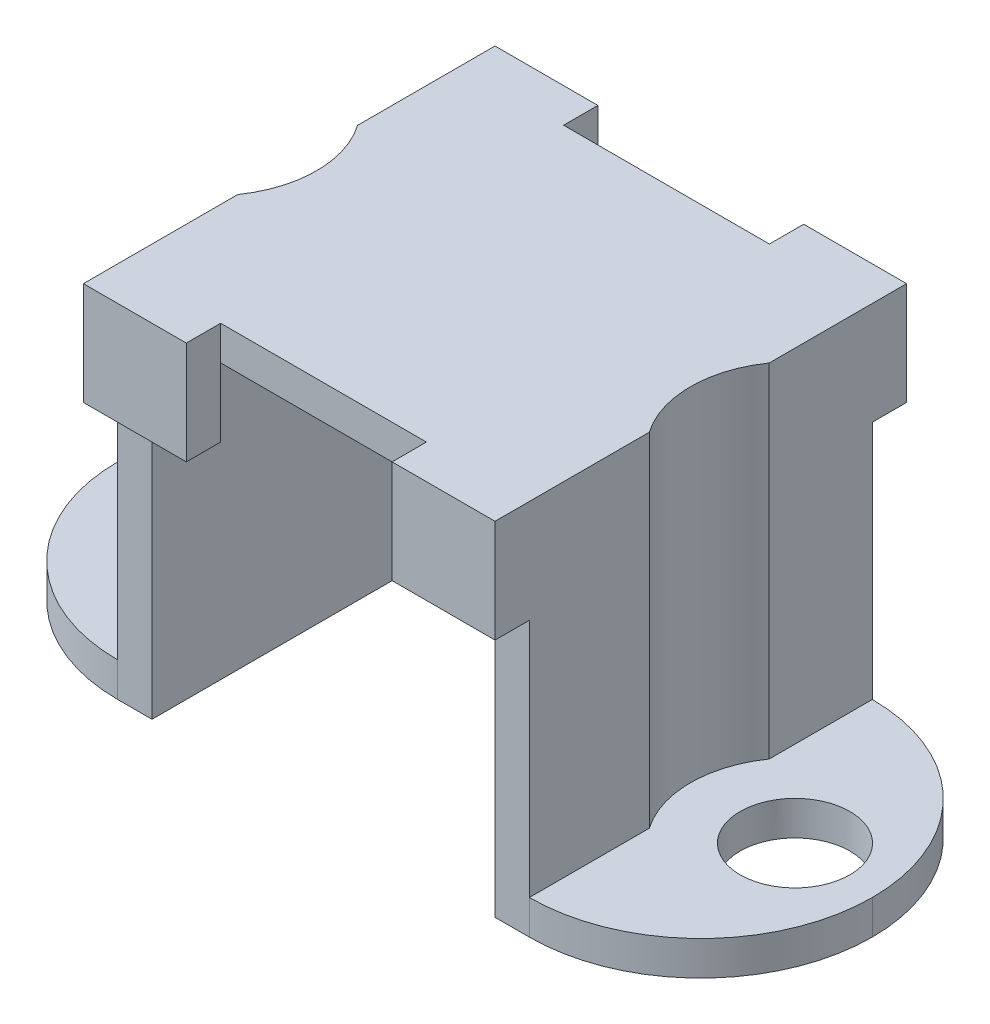
ISO-10303-21;
HEADER;
FILE_DESCRIPTION(('STEP AP214'),'2;1');
FILE_NAME('part.step','',(''),(''),'','','');
FILE_SCHEMA(('AUTOMOTIVE_DESIGN { 1 0 10303 214 1 1 1 1 }'));
ENDSEC;
DATA;
#1=APPLICATION_CONTEXT('core data for automotive mechanical design processes');
#2=APPLICATION_PROTOCOL_DEFINITION('international standard','automotive_design',2000,#1);
#3=PRODUCT_CONTEXT('',#1,'mechanical');
#4=PRODUCT('Part','Part','',(#3));
#5=PRODUCT_RELATED_PRODUCT_CATEGORY('part','',(#4));
#6=PRODUCT_DEFINITION_FORMATION('','',#4);
#7=PRODUCT_DEFINITION_CONTEXT('part definition',#1,'design');
#8=PRODUCT_DEFINITION('design','',#6,#7);
#9=PRODUCT_DEFINITION_SHAPE('','',#8);
#10=(LENGTH_UNIT() NAMED_UNIT(*) SI_UNIT(.MILLI.,.METRE.));
#11=(NAMED_UNIT(*) PLANE_ANGLE_UNIT() SI_UNIT($,.RADIAN.));
#12=(NAMED_UNIT(*) SI_UNIT($,.STERADIAN.) SOLID_ANGLE_UNIT());
#13=UNCERTAINTY_MEASURE_WITH_UNIT(LENGTH_MEASURE(1.E-05),#10,'distance_accuracy_value','');
#14=(GEOMETRIC_REPRESENTATION_CONTEXT(3) GLOBAL_UNCERTAINTY_ASSIGNED_CONTEXT((#13)) GLOBAL_UNIT_ASSIGNED_CONTEXT((#10,
#11,#12)) REPRESENTATION_CONTEXT('',''));
#15=CARTESIAN_POINT('',(0.,0.,0.));
#16=DIRECTION('',(0.,0.,1.));
#17=DIRECTION('',(1.,0.,0.));
#18=AXIS2_PLACEMENT_3D('',#15,#16,#17);
#19=CARTESIAN_POINT('',(0.,1.,5.));
#20=DIRECTION('',(0.,0.,-1.));
#21=DIRECTION('',(-1.,0.,0.));
#22=AXIS2_PLACEMENT_3D('',#19,#20,#21);
#23=PLANE('',#22);
#24=DIRECTION('',(-1.,0.,0.));
#25=VECTOR('',#24,1.);
#26=CARTESIAN_POINT('',(6.,-10.,5.));
#27=LINE('',#26,#25);
#28=CARTESIAN_POINT('',(6.,-10.,5.));
#29=VERTEX_POINT('',#28);
#30=CARTESIAN_POINT('',(5.,-10.,5.));
#31=VERTEX_POINT('',#30);
#32=EDGE_CURVE('E454',#29,#31,#27,.T.);
#33=ORIENTED_EDGE('',*,*,#32,.F.);
#34=DIRECTION('',(0.,-1.,0.));
#35=VECTOR('',#34,1.);
#36=CARTESIAN_POINT('',(6.,1.,5.));
#37=LINE('',#36,#35);
#38=CARTESIAN_POINT('',(6.,-9.,5.));
#39=VERTEX_POINT('',#38);
#40=EDGE_CURVE('E495',#29,#39,#37,.F.);
#41=ORIENTED_EDGE('',*,*,#40,.T.);
#42=DIRECTION('',(0.,-1.,0.));
#43=VECTOR('',#42,1.);
#44=CARTESIAN_POINT('',(6.,1.,5.));
#45=LINE('',#44,#43);
#46=CARTESIAN_POINT('',(6.,-2.,5.));
#47=VERTEX_POINT('',#46);
#48=EDGE_CURVE('E489',#47,#39,#45,.T.);
#49=ORIENTED_EDGE('',*,*,#48,.F.);
#50=DIRECTION('',(1.,0.,0.));
#51=VECTOR('',#50,1.);
#52=CARTESIAN_POINT('',(3.,-2.,5.));
#53=LINE('',#52,#51);
#54=CARTESIAN_POINT('',(5.,-2.,5.));
#55=VERTEX_POINT('',#54);
#56=EDGE_CURVE('E396',#55,#47,#53,.T.);
#57=ORIENTED_EDGE('',*,*,#56,.F.);
#58=DIRECTION('',(0.,1.,0.));
#59=VECTOR('',#58,1.);
#60=CARTESIAN_POINT('',(5.,-10.,5.));
#61=LINE('',#60,#59);
#62=EDGE_CURVE('E467',#31,#55,#61,.T.);
#63=ORIENTED_EDGE('',*,*,#62,.F.);
#64=EDGE_LOOP('',(#33,#41,#49,#57,#63));
#65=FACE_BOUND('',#64,.T.);
#66=ADVANCED_FACE('F34',(#65),#23,.F.);
#67=DIRECTION('',(0.,-1.,0.));
#68=VECTOR('',#67,1.);
#69=CARTESIAN_POINT('',(3.,-2.,5.));
#70=LINE('',#69,#68);
#71=CARTESIAN_POINT('',(3.,1.,5.));
#72=VERTEX_POINT('',#71);
#73=CARTESIAN_POINT('',(3.,0.,5.));
#74=VERTEX_POINT('',#73);
#75=EDGE_CURVE('E390',#72,#74,#70,.T.);
#76=ORIENTED_EDGE('',*,*,#75,.F.);
#77=DIRECTION('',(1.,0.,0.));
#78=VECTOR('',#77,1.);
#79=CARTESIAN_POINT('',(0.,1.,5.));
#80=LINE('',#79,#78);
#81=CARTESIAN_POINT('',(-3.,1.,5.));
#82=VERTEX_POINT('',#81);
#83=EDGE_CURVE('E471',#82,#72,#80,.T.);
#84=ORIENTED_EDGE('',*,*,#83,.F.);
#85=DIRECTION('',(0.,-1.,0.));
#86=VECTOR('',#85,1.);
#87=CARTESIAN_POINT('',(-3.,-2.,5.));
#88=LINE('',#87,#86);
#89=CARTESIAN_POINT('',(-3.,0.,5.));
#90=VERTEX_POINT('',#89);
#91=EDGE_CURVE('E272',#82,#90,#88,.T.);
#92=ORIENTED_EDGE('',*,*,#91,.T.);
#93=DIRECTION('',(1.,0.,0.));
#94=VECTOR('',#93,1.);
#95=CARTESIAN_POINT('',(0.,0.,5.));
#96=LINE('',#95,#94);
#97=EDGE_CURVE('E482',#90,#74,#96,.T.);
#98=ORIENTED_EDGE('',*,*,#97,.T.);
#99=EDGE_LOOP('',(#76,#84,#92,#98));
#100=FACE_BOUND('',#99,.T.);
#101=ADVANCED_FACE('F629',(#100),#23,.F.);
#102=CARTESIAN_POINT('',(0.,1.,-5.));
#103=DIRECTION('',(0.,0.,1.));
#104=DIRECTION('',(1.,0.,0.));
#105=AXIS2_PLACEMENT_3D('',#102,#103,#104);
#106=PLANE('',#105);
#107=DIRECTION('',(0.,1.,0.));
#108=VECTOR('',#107,1.);
#109=CARTESIAN_POINT('',(3.,-2.,-5.));
#110=LINE('',#109,#108);
#111=CARTESIAN_POINT('',(3.,0.,-5.));
#112=VERTEX_POINT('',#111);
#113=CARTESIAN_POINT('',(3.,1.,-5.));
#114=VERTEX_POINT('',#113);
#115=EDGE_CURVE('E423',#112,#114,#110,.T.);
#116=ORIENTED_EDGE('',*,*,#115,.F.);
#117=DIRECTION('',(-1.,0.,0.));
#118=VECTOR('',#117,1.);
#119=CARTESIAN_POINT('',(0.,0.,-5.));
#120=LINE('',#119,#118);
#121=CARTESIAN_POINT('',(-3.,0.,-5.));
#122=VERTEX_POINT('',#121);
#123=EDGE_CURVE('E484',#112,#122,#120,.T.);
#124=ORIENTED_EDGE('',*,*,#123,.T.);
#125=DIRECTION('',(0.,1.,0.));
#126=VECTOR('',#125,1.);
#127=CARTESIAN_POINT('',(-3.,-2.,-5.));
#128=LINE('',#127,#126);
#129=CARTESIAN_POINT('',(-3.,1.,-5.));
#130=VERTEX_POINT('',#129);
#131=EDGE_CURVE('E306',#122,#130,#128,.T.);
#132=ORIENTED_EDGE('',*,*,#131,.T.);
#133=DIRECTION('',(-1.,0.,0.));
#134=VECTOR('',#133,1.);
#135=CARTESIAN_POINT('',(0.,1.,-5.));
#136=LINE('',#135,#134);
#137=EDGE_CURVE('E479',#114,#130,#136,.T.);
#138=ORIENTED_EDGE('',*,*,#137,.F.);
#139=EDGE_LOOP('',(#116,#124,#132,#138));
#140=FACE_BOUND('',#139,.T.);
#141=ADVANCED_FACE('F558',(#140),#106,.F.);
#142=DIRECTION('',(0.,-1.,0.));
#143=VECTOR('',#142,1.);
#144=CARTESIAN_POINT('',(6.,1.,-5.));
#145=LINE('',#144,#143);
#146=CARTESIAN_POINT('',(6.,-2.,-5.));
#147=VERTEX_POINT('',#146);
#148=CARTESIAN_POINT('',(6.,-9.,-5.));
#149=VERTEX_POINT('',#148);
#150=EDGE_CURVE('E481',#147,#149,#145,.T.);
#151=ORIENTED_EDGE('',*,*,#150,.T.);
#152=DIRECTION('',(0.,1.,0.));
#153=VECTOR('',#152,1.);
#154=CARTESIAN_POINT('',(6.,1.,-5.));
#155=LINE('',#154,#153);
#156=CARTESIAN_POINT('',(6.,-10.,-5.));
#157=VERTEX_POINT('',#156);
#158=EDGE_CURVE('E11',#149,#157,#155,.F.);
#159=ORIENTED_EDGE('',*,*,#158,.T.);
#160=DIRECTION('',(1.,0.,0.));
#161=VECTOR('',#160,1.);
#162=CARTESIAN_POINT('',(6.,-10.,-5.));
#163=LINE('',#162,#161);
#164=CARTESIAN_POINT('',(5.,-10.,-5.));
#165=VERTEX_POINT('',#164);
#166=EDGE_CURVE('E458',#165,#157,#163,.T.);
#167=ORIENTED_EDGE('',*,*,#166,.F.);
#168=DIRECTION('',(0.,1.,0.));
#169=VECTOR('',#168,1.);
#170=CARTESIAN_POINT('',(5.,-10.,-5.));
#171=LINE('',#170,#169);
#172=CARTESIAN_POINT('',(5.,-2.,-5.));
#173=VERTEX_POINT('',#172);
#174=EDGE_CURVE('E464',#165,#173,#171,.T.);
#175=ORIENTED_EDGE('',*,*,#174,.T.);
#176=DIRECTION('',(-1.,0.,0.));
#177=VECTOR('',#176,1.);
#178=CARTESIAN_POINT('',(3.,-2.,-5.));
#179=LINE('',#178,#177);
#180=EDGE_CURVE('E418',#147,#173,#179,.T.);
#181=ORIENTED_EDGE('',*,*,#180,.F.);
#182=EDGE_LOOP('',(#151,#159,#167,#175,#181));
#183=FACE_BOUND('',#182,.T.);
#184=ADVANCED_FACE('F509',(#183),#106,.F.);
#185=CARTESIAN_POINT('',(6.,1.,-5.));
#186=DIRECTION('',(-1.,0.,0.));
#187=DIRECTION('',(0.,0.,1.));
#188=AXIS2_PLACEMENT_3D('',#185,#186,#187);
#189=PLANE('',#188);
#190=DIRECTION('',(0.,0.,1.));
#191=VECTOR('',#190,1.);
#192=CARTESIAN_POINT('',(6.,-9.,5.));
#193=LINE('',#192,#191);
#194=CARTESIAN_POINT('',(6.,-9.,1.50052587873728));
#195=VERTEX_POINT('',#194);
#196=EDGE_CURVE('E447',#195,#39,#193,.T.);
#197=ORIENTED_EDGE('',*,*,#196,.F.);
#198=DIRECTION('',(0.,1.,0.));
#199=VECTOR('',#198,1.);
#200=CARTESIAN_POINT('',(6.,-9.,1.50052587873728));
#201=LINE('',#200,#199);
#202=CARTESIAN_POINT('',(6.,1.,1.50052587873728));
#203=VERTEX_POINT('',#202);
#204=EDGE_CURVE('E440',#195,#203,#201,.T.);
#205=ORIENTED_EDGE('',*,*,#204,.T.);
#206=DIRECTION('',(0.,0.,-1.));
#207=VECTOR('',#206,1.);
#208=CARTESIAN_POINT('',(6.,1.,-5.));
#209=LINE('',#208,#207);
#210=CARTESIAN_POINT('',(6.,1.,6.));
#211=VERTEX_POINT('',#210);
#212=EDGE_CURVE('E476',#211,#203,#209,.T.);
#213=ORIENTED_EDGE('',*,*,#212,.F.);
#214=DIRECTION('',(0.,1.,0.));
#215=VECTOR('',#214,1.);
#216=CARTESIAN_POINT('',(6.,-2.,6.));
#217=LINE('',#216,#215);
#218=CARTESIAN_POINT('',(6.,-2.,6.));
#219=VERTEX_POINT('',#218);
#220=EDGE_CURVE('E379',#219,#211,#217,.T.);
#221=ORIENTED_EDGE('',*,*,#220,.F.);
#222=DIRECTION('',(0.,0.,-1.));
#223=VECTOR('',#222,1.);
#224=CARTESIAN_POINT('',(6.,-2.,6.));
#225=LINE('',#224,#223);
#226=EDGE_CURVE('E389',#219,#47,#225,.T.);
#227=ORIENTED_EDGE('',*,*,#226,.T.);
#228=ORIENTED_EDGE('',*,*,#48,.T.);
#229=EDGE_LOOP('',(#197,#205,#213,#221,#227,#228));
#230=FACE_BOUND('',#229,.T.);
#231=ADVANCED_FACE('F542',(#230),#189,.F.);
#232=CARTESIAN_POINT('',(6.,1.,-1.99375516319396));
#233=VERTEX_POINT('',#232);
#234=CARTESIAN_POINT('',(6.,1.,-6.));
#235=VERTEX_POINT('',#234);
#236=EDGE_CURVE('E474',#233,#235,#209,.T.);
#237=ORIENTED_EDGE('',*,*,#236,.F.);
#238=DIRECTION('',(0.,1.,0.));
#239=VECTOR('',#238,1.);
#240=CARTESIAN_POINT('',(6.,-9.,-1.99375516319396));
#241=LINE('',#240,#239);
#242=CARTESIAN_POINT('',(6.,-9.,-1.99375516319396));
#243=VERTEX_POINT('',#242);
#244=EDGE_CURVE('E436',#233,#243,#241,.F.);
#245=ORIENTED_EDGE('',*,*,#244,.T.);
#246=EDGE_CURVE('E450',#149,#243,#193,.T.);
#247=ORIENTED_EDGE('',*,*,#246,.F.);
#248=ORIENTED_EDGE('',*,*,#150,.F.);
#249=DIRECTION('',(0.,0.,1.));
#250=VECTOR('',#249,1.);
#251=CARTESIAN_POINT('',(6.,-2.,-6.));
#252=LINE('',#251,#250);
#253=CARTESIAN_POINT('',(6.,-2.,-6.));
#254=VERTEX_POINT('',#253);
#255=EDGE_CURVE('E429',#254,#147,#252,.T.);
#256=ORIENTED_EDGE('',*,*,#255,.F.);
#257=DIRECTION('',(0.,-1.,0.));
#258=VECTOR('',#257,1.);
#259=CARTESIAN_POINT('',(6.,-2.,-6.));
#260=LINE('',#259,#258);
#261=EDGE_CURVE('E406',#235,#254,#260,.T.);
#262=ORIENTED_EDGE('',*,*,#261,.F.);
#263=EDGE_LOOP('',(#237,#245,#247,#248,#256,#262));
#264=FACE_BOUND('',#263,.T.);
#265=ADVANCED_FACE('F514',(#264),#189,.F.);
#266=CARTESIAN_POINT('',(0.,0.,0.));
#267=DIRECTION('',(0.,1.,0.));
#268=DIRECTION('',(0.,0.,1.));
#269=AXIS2_PLACEMENT_3D('',#266,#267,#268);
#270=PLANE('',#269);
#271=DIRECTION('',(0.,0.,-1.));
#272=VECTOR('',#271,1.);
#273=CARTESIAN_POINT('',(5.,0.,-5.));
#274=LINE('',#273,#272);
#275=CARTESIAN_POINT('',(5.,0.,5.));
#276=VERTEX_POINT('',#275);
#277=CARTESIAN_POINT('',(5.,0.,-5.));
#278=VERTEX_POINT('',#277);
#279=EDGE_CURVE('E453',#276,#278,#274,.T.);
#280=ORIENTED_EDGE('',*,*,#279,.F.);
#281=EDGE_CURVE('E470',#74,#276,#96,.T.);
#282=ORIENTED_EDGE('',*,*,#281,.F.);
#283=ORIENTED_EDGE('',*,*,#97,.F.);
#284=DIRECTION('',(-1.,0.,0.));
#285=VECTOR('',#284,1.);
#286=CARTESIAN_POINT('',(0.,0.,5.));
#287=LINE('',#286,#285);
#288=CARTESIAN_POINT('',(-5.,0.,5.));
#289=VERTEX_POINT('',#288);
#290=EDGE_CURVE('E349',#90,#289,#287,.T.);
#291=ORIENTED_EDGE('',*,*,#290,.T.);
#292=DIRECTION('',(0.,0.,-1.));
#293=VECTOR('',#292,1.);
#294=CARTESIAN_POINT('',(-5.,0.,-5.));
#295=LINE('',#294,#293);
#296=CARTESIAN_POINT('',(-5.,0.,-5.));
#297=VERTEX_POINT('',#296);
#298=EDGE_CURVE('E331',#289,#297,#295,.T.);
#299=ORIENTED_EDGE('',*,*,#298,.T.);
#300=DIRECTION('',(1.,0.,0.));
#301=VECTOR('',#300,1.);
#302=CARTESIAN_POINT('',(0.,0.,-5.));
#303=LINE('',#302,#301);
#304=EDGE_CURVE('E353',#297,#122,#303,.T.);
#305=ORIENTED_EDGE('',*,*,#304,.T.);
#306=ORIENTED_EDGE('',*,*,#123,.F.);
#307=EDGE_CURVE('E475',#278,#112,#120,.T.);
#308=ORIENTED_EDGE('',*,*,#307,.F.);
#309=EDGE_LOOP('',(#280,#282,#283,#291,#299,#305,#306,#308));
#310=FACE_BOUND('',#309,.T.);
#311=ADVANCED_FACE('F561',(#310),#270,.F.);
#312=CARTESIAN_POINT('',(0.,1.,0.));
#313=DIRECTION('',(0.,1.,0.));
#314=DIRECTION('',(0.,0.,1.));
#315=AXIS2_PLACEMENT_3D('',#312,#313,#314);
#316=PLANE('',#315);
#317=CARTESIAN_POINT('',(8.5,1.,-0.246614642228339));
#318=DIRECTION('',(0.,1.,0.));
#319=DIRECTION('',(0.,0.,1.));
#320=AXIS2_PLACEMENT_3D('',#317,#318,#319);
#321=CIRCLE('',#320,3.05);
#322=EDGE_CURVE('E432',#233,#203,#321,.T.);
#323=ORIENTED_EDGE('',*,*,#322,.F.);
#324=ORIENTED_EDGE('',*,*,#236,.T.);
#325=DIRECTION('',(1.,0.,0.));
#326=VECTOR('',#325,1.);
#327=CARTESIAN_POINT('',(3.,1.,-6.));
#328=LINE('',#327,#326);
#329=CARTESIAN_POINT('',(3.,1.,-6.));
#330=VERTEX_POINT('',#329);
#331=EDGE_CURVE('E414',#330,#235,#328,.T.);
#332=ORIENTED_EDGE('',*,*,#331,.F.);
#333=DIRECTION('',(0.,0.,1.));
#334=VECTOR('',#333,1.);
#335=CARTESIAN_POINT('',(3.,1.,-6.));
#336=LINE('',#335,#334);
#337=EDGE_CURVE('E417',#330,#114,#336,.T.);
#338=ORIENTED_EDGE('',*,*,#337,.T.);
#339=ORIENTED_EDGE('',*,*,#137,.T.);
#340=DIRECTION('',(0.,0.,1.));
#341=VECTOR('',#340,1.);
#342=CARTESIAN_POINT('',(-3.,1.,-6.));
#343=LINE('',#342,#341);
#344=CARTESIAN_POINT('',(-3.,1.,-6.));
#345=VERTEX_POINT('',#344);
#346=EDGE_CURVE('E300',#345,#130,#343,.T.);
#347=ORIENTED_EDGE('',*,*,#346,.F.);
#348=DIRECTION('',(-1.,0.,0.));
#349=VECTOR('',#348,1.);
#350=CARTESIAN_POINT('',(-3.,1.,-6.));
#351=LINE('',#350,#349);
#352=CARTESIAN_POINT('',(-6.,1.,-6.));
#353=VERTEX_POINT('',#352);
#354=EDGE_CURVE('E298',#345,#353,#351,.T.);
#355=ORIENTED_EDGE('',*,*,#354,.T.);
#356=DIRECTION('',(0.,0.,-1.));
#357=VECTOR('',#356,1.);
#358=CARTESIAN_POINT('',(-6.,1.,-5.));
#359=LINE('',#358,#357);
#360=CARTESIAN_POINT('',(-6.,1.,-1.99375516319396));
#361=VERTEX_POINT('',#360);
#362=EDGE_CURVE('E264',#361,#353,#359,.T.);
#363=ORIENTED_EDGE('',*,*,#362,.F.);
#364=CARTESIAN_POINT('',(-8.5,1.,-0.246614642228339));
#365=DIRECTION('',(0.,-1.,0.));
#366=DIRECTION('',(0.,0.,1.));
#367=AXIS2_PLACEMENT_3D('',#364,#365,#366);
#368=CIRCLE('',#367,3.05);
#369=CARTESIAN_POINT('',(-6.,1.,1.50052587873728));
#370=VERTEX_POINT('',#369);
#371=EDGE_CURVE('E259',#361,#370,#368,.T.);
#372=ORIENTED_EDGE('',*,*,#371,.T.);
#373=CARTESIAN_POINT('',(-6.,1.,6.));
#374=VERTEX_POINT('',#373);
#375=EDGE_CURVE('E255',#374,#370,#359,.T.);
#376=ORIENTED_EDGE('',*,*,#375,.F.);
#377=DIRECTION('',(1.,0.,0.));
#378=VECTOR('',#377,1.);
#379=CARTESIAN_POINT('',(-3.,1.,6.));
#380=LINE('',#379,#378);
#381=CARTESIAN_POINT('',(-3.,1.,6.));
#382=VERTEX_POINT('',#381);
#383=EDGE_CURVE('E242',#374,#382,#380,.T.);
#384=ORIENTED_EDGE('',*,*,#383,.T.);
#385=DIRECTION('',(0.,0.,-1.));
#386=VECTOR('',#385,1.);
#387=CARTESIAN_POINT('',(-3.,1.,6.));
#388=LINE('',#387,#386);
#389=EDGE_CURVE('E286',#382,#82,#388,.T.);
#390=ORIENTED_EDGE('',*,*,#389,.T.);
#391=ORIENTED_EDGE('',*,*,#83,.T.);
#392=DIRECTION('',(0.,0.,-1.));
#393=VECTOR('',#392,1.);
#394=CARTESIAN_POINT('',(3.,1.,6.));
#395=LINE('',#394,#393);
#396=CARTESIAN_POINT('',(3.,1.,6.));
#397=VERTEX_POINT('',#396);
#398=EDGE_CURVE('E402',#397,#72,#395,.T.);
#399=ORIENTED_EDGE('',*,*,#398,.F.);
#400=DIRECTION('',(-1.,0.,0.));
#401=VECTOR('',#400,1.);
#402=CARTESIAN_POINT('',(3.,1.,6.));
#403=LINE('',#402,#401);
#404=EDGE_CURVE('E382',#211,#397,#403,.T.);
#405=ORIENTED_EDGE('',*,*,#404,.F.);
#406=ORIENTED_EDGE('',*,*,#212,.T.);
#407=EDGE_LOOP('',(#323,#324,#332,#338,#339,#347,#355,#363,#372,#376,#384,#390,#391,#399,#405,#406));
#408=FACE_BOUND('',#407,.T.);
#409=ADVANCED_FACE('F257',(#408),#316,.T.);
#410=CARTESIAN_POINT('',(5.,-10.,-5.));
#411=DIRECTION('',(1.,0.,0.));
#412=DIRECTION('',(0.,0.,-1.));
#413=AXIS2_PLACEMENT_3D('',#410,#411,#412);
#414=PLANE('',#413);
#415=ORIENTED_EDGE('',*,*,#279,.T.);
#416=EDGE_CURVE('E461',#173,#278,#171,.T.);
#417=ORIENTED_EDGE('',*,*,#416,.F.);
#418=ORIENTED_EDGE('',*,*,#174,.F.);
#419=DIRECTION('',(0.,0.,-1.));
#420=VECTOR('',#419,1.);
#421=CARTESIAN_POINT('',(5.,-10.,-5.));
#422=LINE('',#421,#420);
#423=EDGE_CURVE('E456',#31,#165,#422,.T.);
#424=ORIENTED_EDGE('',*,*,#423,.F.);
#425=ORIENTED_EDGE('',*,*,#62,.T.);
#426=EDGE_CURVE('E466',#55,#276,#61,.T.);
#427=ORIENTED_EDGE('',*,*,#426,.T.);
#428=EDGE_LOOP('',(#415,#417,#418,#424,#425,#427));
#429=FACE_BOUND('',#428,.T.);
#430=ADVANCED_FACE('F523',(#429),#414,.F.);
#431=CARTESIAN_POINT('',(0.,-10.,0.));
#432=DIRECTION('',(0.,-1.,0.));
#433=DIRECTION('',(0.,0.,-1.));
#434=AXIS2_PLACEMENT_3D('',#431,#432,#433);
#435=PLANE('',#434);
#436=CARTESIAN_POINT('',(8.5,-10.,-0.246614642228339));
#437=DIRECTION('',(0.,-1.,0.));
#438=DIRECTION('',(0.,0.,-1.));
#439=AXIS2_PLACEMENT_3D('',#436,#437,#438);
#440=CIRCLE('',#439,1.6);
#441=CARTESIAN_POINT('',(8.5,-10.,-1.84661464222834));
#442=VERTEX_POINT('',#441);
#443=EDGE_CURVE('E443',#442,#442,#440,.F.);
#444=ORIENTED_EDGE('',*,*,#443,.T.);
#445=EDGE_LOOP('',(#444));
#446=FACE_BOUND('',#445,.T.);
#447=CARTESIAN_POINT('',(6.,-10.,0.));
#448=DIRECTION('',(0.,-1.,0.));
#449=DIRECTION('',(0.,0.,-1.));
#450=AXIS2_PLACEMENT_3D('',#447,#448,#449);
#451=CIRCLE('',#450,5.);
#452=CARTESIAN_POINT('',(11.,-10.,0.));
#453=VERTEX_POINT('',#452);
#454=EDGE_CURVE('E492',#157,#453,#451,.T.);
#455=ORIENTED_EDGE('',*,*,#454,.T.);
#456=CARTESIAN_POINT('',(6.,-10.,0.));
#457=DIRECTION('',(0.,-1.,0.));
#458=DIRECTION('',(0.,0.,-1.));
#459=AXIS2_PLACEMENT_3D('',#456,#457,#458);
#460=CIRCLE('',#459,5.);
#461=EDGE_CURVE('E57',#453,#29,#460,.T.);
#462=ORIENTED_EDGE('',*,*,#461,.T.);
#463=ORIENTED_EDGE('',*,*,#32,.T.);
#464=ORIENTED_EDGE('',*,*,#423,.T.);
#465=ORIENTED_EDGE('',*,*,#166,.T.);
#466=EDGE_LOOP('',(#455,#462,#463,#464,#465));
#467=FACE_BOUND('',#466,.T.);
#468=ADVANCED_FACE('F516',(#446,#467),#435,.T.);
#469=CARTESIAN_POINT('',(11.,-9.,5.));
#470=DIRECTION('',(0.,-1.,0.));
#471=DIRECTION('',(0.,0.,-1.));
#472=AXIS2_PLACEMENT_3D('',#469,#470,#471);
#473=PLANE('',#472);
#474=ORIENTED_EDGE('',*,*,#196,.T.);
#475=CARTESIAN_POINT('',(6.,-9.,0.));
#476=DIRECTION('',(0.,-1.,0.));
#477=DIRECTION('',(0.,0.,-1.));
#478=AXIS2_PLACEMENT_3D('',#475,#476,#477);
#479=CIRCLE('',#478,5.);
#480=CARTESIAN_POINT('',(11.,-9.,0.));
#481=VERTEX_POINT('',#480);
#482=EDGE_CURVE('E43',#39,#481,#479,.F.);
#483=ORIENTED_EDGE('',*,*,#482,.T.);
#484=CARTESIAN_POINT('',(6.,-9.,0.));
#485=DIRECTION('',(0.,-1.,0.));
#486=DIRECTION('',(0.,0.,-1.));
#487=AXIS2_PLACEMENT_3D('',#484,#485,#486);
#488=CIRCLE('',#487,5.);
#489=EDGE_CURVE('E498',#481,#149,#488,.F.);
#490=ORIENTED_EDGE('',*,*,#489,.T.);
#491=ORIENTED_EDGE('',*,*,#246,.T.);
#492=CARTESIAN_POINT('',(8.5,-9.,-0.246614642228339));
#493=DIRECTION('',(0.,1.,0.));
#494=DIRECTION('',(0.,0.,1.));
#495=AXIS2_PLACEMENT_3D('',#492,#493,#494);
#496=CIRCLE('',#495,3.05);
#497=EDGE_CURVE('E433',#243,#195,#496,.T.);
#498=ORIENTED_EDGE('',*,*,#497,.T.);
#499=EDGE_LOOP('',(#474,#483,#490,#491,#498));
#500=FACE_BOUND('',#499,.T.);
#501=CARTESIAN_POINT('',(8.5,-9.,-0.246614642228339));
#502=DIRECTION('',(0.,1.,0.));
#503=DIRECTION('',(0.,0.,1.));
#504=AXIS2_PLACEMENT_3D('',#501,#502,#503);
#505=CIRCLE('',#504,1.6);
#506=CARTESIAN_POINT('',(8.5,-9.,1.35338535777166));
#507=VERTEX_POINT('',#506);
#508=EDGE_CURVE('E444',#507,#507,#505,.T.);
#509=ORIENTED_EDGE('',*,*,#508,.F.);
#510=EDGE_LOOP('',(#509));
#511=FACE_BOUND('',#510,.T.);
#512=ADVANCED_FACE('F500',(#500,#511),#473,.F.);
#513=CARTESIAN_POINT('',(8.5,-10.001,-0.246614642228339));
#514=DIRECTION('',(0.,1.,0.));
#515=DIRECTION('',(0.,0.,1.));
#516=AXIS2_PLACEMENT_3D('',#513,#514,#515);
#517=CYLINDRICAL_SURFACE('',#516,1.6);
#518=ORIENTED_EDGE('',*,*,#443,.F.);
#519=EDGE_LOOP('',(#518));
#520=FACE_BOUND('',#519,.T.);
#521=ORIENTED_EDGE('',*,*,#508,.T.);
#522=EDGE_LOOP('',(#521));
#523=FACE_BOUND('',#522,.T.);
#524=ADVANCED_FACE('F649',(#520,#523),#517,.F.);
#525=CARTESIAN_POINT('',(8.5,-9.,-0.246614642228339));
#526=DIRECTION('',(0.,1.,0.));
#527=DIRECTION('',(0.,0.,1.));
#528=AXIS2_PLACEMENT_3D('',#525,#526,#527);
#529=CYLINDRICAL_SURFACE('',#528,3.05);
#530=ORIENTED_EDGE('',*,*,#497,.F.);
#531=ORIENTED_EDGE('',*,*,#244,.F.);
#532=ORIENTED_EDGE('',*,*,#322,.T.);
#533=ORIENTED_EDGE('',*,*,#204,.F.);
#534=EDGE_LOOP('',(#530,#531,#532,#533));
#535=FACE_BOUND('',#534,.T.);
#536=ADVANCED_FACE('F539',(#535),#529,.F.);
#537=CARTESIAN_POINT('',(0.,0.,-5.));
#538=DIRECTION('',(0.,0.,-1.));
#539=DIRECTION('',(-1.,0.,0.));
#540=AXIS2_PLACEMENT_3D('',#537,#538,#539);
#541=PLANE('',#540);
#542=CARTESIAN_POINT('',(3.,-2.,-5.));
#543=VERTEX_POINT('',#542);
#544=EDGE_CURVE('E405',#173,#543,#179,.T.);
#545=ORIENTED_EDGE('',*,*,#544,.F.);
#546=ORIENTED_EDGE('',*,*,#416,.T.);
#547=ORIENTED_EDGE('',*,*,#307,.T.);
#548=EDGE_CURVE('E410',#543,#112,#110,.T.);
#549=ORIENTED_EDGE('',*,*,#548,.F.);
#550=EDGE_LOOP('',(#545,#546,#547,#549));
#551=FACE_BOUND('',#550,.T.);
#552=ADVANCED_FACE('F527',(#551),#541,.F.);
#553=CARTESIAN_POINT('',(3.,-2.,-6.));
#554=DIRECTION('',(0.,1.,0.));
#555=DIRECTION('',(0.,0.,1.));
#556=AXIS2_PLACEMENT_3D('',#553,#554,#555);
#557=PLANE('',#556);
#558=ORIENTED_EDGE('',*,*,#180,.T.);
#559=ORIENTED_EDGE('',*,*,#544,.T.);
#560=DIRECTION('',(0.,0.,1.));
#561=VECTOR('',#560,1.);
#562=CARTESIAN_POINT('',(3.,-2.,-6.));
#563=LINE('',#562,#561);
#564=CARTESIAN_POINT('',(3.,-2.,-6.));
#565=VERTEX_POINT('',#564);
#566=EDGE_CURVE('E426',#565,#543,#563,.T.);
#567=ORIENTED_EDGE('',*,*,#566,.F.);
#568=DIRECTION('',(-1.,0.,0.));
#569=VECTOR('',#568,1.);
#570=CARTESIAN_POINT('',(3.,-2.,-6.));
#571=LINE('',#570,#569);
#572=EDGE_CURVE('E409',#254,#565,#571,.T.);
#573=ORIENTED_EDGE('',*,*,#572,.F.);
#574=ORIENTED_EDGE('',*,*,#255,.T.);
#575=EDGE_LOOP('',(#558,#559,#567,#573,#574));
#576=FACE_BOUND('',#575,.T.);
#577=ADVANCED_FACE('F530',(#576),#557,.F.);
#578=CARTESIAN_POINT('',(3.,-2.,-6.));
#579=DIRECTION('',(1.,0.,0.));
#580=DIRECTION('',(0.,0.,-1.));
#581=AXIS2_PLACEMENT_3D('',#578,#579,#580);
#582=PLANE('',#581);
#583=ORIENTED_EDGE('',*,*,#548,.T.);
#584=ORIENTED_EDGE('',*,*,#115,.T.);
#585=ORIENTED_EDGE('',*,*,#337,.F.);
#586=DIRECTION('',(0.,1.,0.));
#587=VECTOR('',#586,1.);
#588=CARTESIAN_POINT('',(3.,-2.,-6.));
#589=LINE('',#588,#587);
#590=EDGE_CURVE('E412',#565,#330,#589,.T.);
#591=ORIENTED_EDGE('',*,*,#590,.F.);
#592=ORIENTED_EDGE('',*,*,#566,.T.);
#593=EDGE_LOOP('',(#583,#584,#585,#591,#592));
#594=FACE_BOUND('',#593,.T.);
#595=ADVANCED_FACE('F555',(#594),#582,.F.);
#596=CARTESIAN_POINT('',(0.,0.,-6.));
#597=DIRECTION('',(0.,0.,-1.));
#598=DIRECTION('',(-1.,0.,0.));
#599=AXIS2_PLACEMENT_3D('',#596,#597,#598);
#600=PLANE('',#599);
#601=ORIENTED_EDGE('',*,*,#261,.T.);
#602=ORIENTED_EDGE('',*,*,#572,.T.);
#603=ORIENTED_EDGE('',*,*,#590,.T.);
#604=ORIENTED_EDGE('',*,*,#331,.T.);
#605=EDGE_LOOP('',(#601,#602,#603,#604));
#606=FACE_BOUND('',#605,.T.);
#607=ADVANCED_FACE('F533',(#606),#600,.T.);
#608=CARTESIAN_POINT('',(3.,-2.,6.));
#609=DIRECTION('',(1.,0.,0.));
#610=DIRECTION('',(0.,0.,-1.));
#611=AXIS2_PLACEMENT_3D('',#608,#609,#610);
#612=PLANE('',#611);
#613=ORIENTED_EDGE('',*,*,#75,.T.);
#614=CARTESIAN_POINT('',(3.,-2.,5.));
#615=VERTEX_POINT('',#614);
#616=EDGE_CURVE('E393',#74,#615,#70,.T.);
#617=ORIENTED_EDGE('',*,*,#616,.T.);
#618=DIRECTION('',(0.,0.,-1.));
#619=VECTOR('',#618,1.);
#620=CARTESIAN_POINT('',(3.,-2.,6.));
#621=LINE('',#620,#619);
#622=CARTESIAN_POINT('',(3.,-2.,6.));
#623=VERTEX_POINT('',#622);
#624=EDGE_CURVE('E399',#623,#615,#621,.T.);
#625=ORIENTED_EDGE('',*,*,#624,.F.);
#626=DIRECTION('',(0.,-1.,0.));
#627=VECTOR('',#626,1.);
#628=CARTESIAN_POINT('',(3.,-2.,6.));
#629=LINE('',#628,#627);
#630=EDGE_CURVE('E385',#397,#623,#629,.T.);
#631=ORIENTED_EDGE('',*,*,#630,.F.);
#632=ORIENTED_EDGE('',*,*,#398,.T.);
#633=EDGE_LOOP('',(#613,#617,#625,#631,#632));
#634=FACE_BOUND('',#633,.T.);
#635=ADVANCED_FACE('F611',(#634),#612,.F.);
#636=CARTESIAN_POINT('',(3.,-2.,6.));
#637=DIRECTION('',(0.,1.,0.));
#638=DIRECTION('',(0.,0.,1.));
#639=AXIS2_PLACEMENT_3D('',#636,#637,#638);
#640=PLANE('',#639);
#641=EDGE_CURVE('E383',#615,#55,#53,.T.);
#642=ORIENTED_EDGE('',*,*,#641,.T.);
#643=ORIENTED_EDGE('',*,*,#56,.T.);
#644=ORIENTED_EDGE('',*,*,#226,.F.);
#645=DIRECTION('',(1.,0.,0.));
#646=VECTOR('',#645,1.);
#647=CARTESIAN_POINT('',(3.,-2.,6.));
#648=LINE('',#647,#646);
#649=EDGE_CURVE('E387',#623,#219,#648,.T.);
#650=ORIENTED_EDGE('',*,*,#649,.F.);
#651=ORIENTED_EDGE('',*,*,#624,.T.);
#652=EDGE_LOOP('',(#642,#643,#644,#650,#651));
#653=FACE_BOUND('',#652,.T.);
#654=ADVANCED_FACE('F550',(#653),#640,.F.);
#655=CARTESIAN_POINT('',(0.,0.,6.));
#656=DIRECTION('',(0.,0.,-1.));
#657=DIRECTION('',(-1.,0.,0.));
#658=AXIS2_PLACEMENT_3D('',#655,#656,#657);
#659=PLANE('',#658);
#660=ORIENTED_EDGE('',*,*,#220,.T.);
#661=ORIENTED_EDGE('',*,*,#404,.T.);
#662=ORIENTED_EDGE('',*,*,#630,.T.);
#663=ORIENTED_EDGE('',*,*,#649,.T.);
#664=EDGE_LOOP('',(#660,#661,#662,#663));
#665=FACE_BOUND('',#664,.T.);
#666=ADVANCED_FACE('F614',(#665),#659,.F.);
#667=CARTESIAN_POINT('',(0.,0.,5.));
#668=DIRECTION('',(0.,0.,-1.));
#669=DIRECTION('',(-1.,0.,0.));
#670=AXIS2_PLACEMENT_3D('',#667,#668,#669);
#671=PLANE('',#670);
#672=ORIENTED_EDGE('',*,*,#616,.F.);
#673=ORIENTED_EDGE('',*,*,#281,.T.);
#674=ORIENTED_EDGE('',*,*,#426,.F.);
#675=ORIENTED_EDGE('',*,*,#641,.F.);
#676=EDGE_LOOP('',(#672,#673,#674,#675));
#677=FACE_BOUND('',#676,.T.);
#678=ADVANCED_FACE('F617',(#677),#671,.T.);
#679=CARTESIAN_POINT('',(6.,0.,0.));
#680=DIRECTION('',(0.,1.,0.));
#681=DIRECTION('',(0.,0.,1.));
#682=AXIS2_PLACEMENT_3D('',#679,#680,#681);
#683=CYLINDRICAL_SURFACE('',#682,5.);
#684=ORIENTED_EDGE('',*,*,#158,.F.);
#685=ORIENTED_EDGE('',*,*,#489,.F.);
#686=DIRECTION('',(0.,1.,0.));
#687=VECTOR('',#686,1.);
#688=CARTESIAN_POINT('',(11.,0.,0.));
#689=LINE('',#688,#687);
#690=EDGE_CURVE('E38',#453,#481,#689,.T.);
#691=ORIENTED_EDGE('',*,*,#690,.F.);
#692=ORIENTED_EDGE('',*,*,#454,.F.);
#693=EDGE_LOOP('',(#684,#685,#691,#692));
#694=FACE_BOUND('',#693,.T.);
#695=ADVANCED_FACE('F36',(#694),#683,.T.);
#696=CARTESIAN_POINT('',(6.,0.,0.));
#697=DIRECTION('',(0.,-1.,0.));
#698=DIRECTION('',(0.,0.,-1.));
#699=AXIS2_PLACEMENT_3D('',#696,#697,#698);
#700=CYLINDRICAL_SURFACE('',#699,5.);
#701=ORIENTED_EDGE('',*,*,#482,.F.);
#702=ORIENTED_EDGE('',*,*,#40,.F.);
#703=ORIENTED_EDGE('',*,*,#461,.F.);
#704=ORIENTED_EDGE('',*,*,#690,.T.);
#705=EDGE_LOOP('',(#701,#702,#703,#704));
#706=FACE_BOUND('',#705,.T.);
#707=ADVANCED_FACE('F619',(#706),#700,.T.);
#708=CARTESIAN_POINT('',(0.,1.,5.));
#709=DIRECTION('',(0.,0.,-1.));
#710=DIRECTION('',(1.,0.,0.));
#711=AXIS2_PLACEMENT_3D('',#708,#709,#710);
#712=PLANE('',#711);
#713=DIRECTION('',(1.,0.,0.));
#714=VECTOR('',#713,1.);
#715=CARTESIAN_POINT('',(-6.,-10.,5.));
#716=LINE('',#715,#714);
#717=CARTESIAN_POINT('',(-6.,-10.,5.));
#718=VERTEX_POINT('',#717);
#719=CARTESIAN_POINT('',(-5.,-10.,5.));
#720=VERTEX_POINT('',#719);
#721=EDGE_CURVE('E332',#718,#720,#716,.T.);
#722=ORIENTED_EDGE('',*,*,#721,.T.);
#723=DIRECTION('',(0.,1.,0.));
#724=VECTOR('',#723,1.);
#725=CARTESIAN_POINT('',(-5.,-10.,5.));
#726=LINE('',#725,#724);
#727=CARTESIAN_POINT('',(-5.,-2.,5.));
#728=VERTEX_POINT('',#727);
#729=EDGE_CURVE('E347',#720,#728,#726,.T.);
#730=ORIENTED_EDGE('',*,*,#729,.T.);
#731=DIRECTION('',(-1.,0.,0.));
#732=VECTOR('',#731,1.);
#733=CARTESIAN_POINT('',(-3.,-2.,5.));
#734=LINE('',#733,#732);
#735=CARTESIAN_POINT('',(-6.,-2.,5.));
#736=VERTEX_POINT('',#735);
#737=EDGE_CURVE('E274',#728,#736,#734,.T.);
#738=ORIENTED_EDGE('',*,*,#737,.T.);
#739=DIRECTION('',(0.,-1.,0.));
#740=VECTOR('',#739,1.);
#741=CARTESIAN_POINT('',(-6.,1.,5.));
#742=LINE('',#741,#740);
#743=CARTESIAN_POINT('',(-6.,-9.,5.));
#744=VERTEX_POINT('',#743);
#745=EDGE_CURVE('E358',#736,#744,#742,.T.);
#746=ORIENTED_EDGE('',*,*,#745,.T.);
#747=DIRECTION('',(0.,-1.,0.));
#748=VECTOR('',#747,1.);
#749=CARTESIAN_POINT('',(-6.,1.,5.));
#750=LINE('',#749,#748);
#751=EDGE_CURVE('E366',#718,#744,#750,.F.);
#752=ORIENTED_EDGE('',*,*,#751,.F.);
#753=EDGE_LOOP('',(#722,#730,#738,#746,#752));
#754=FACE_BOUND('',#753,.T.);
#755=ADVANCED_FACE('F576',(#754),#712,.F.);
#756=CARTESIAN_POINT('',(0.,1.,-5.));
#757=DIRECTION('',(0.,0.,1.));
#758=DIRECTION('',(-1.,0.,0.));
#759=AXIS2_PLACEMENT_3D('',#756,#757,#758);
#760=PLANE('',#759);
#761=DIRECTION('',(0.,-1.,0.));
#762=VECTOR('',#761,1.);
#763=CARTESIAN_POINT('',(-6.,1.,-5.));
#764=LINE('',#763,#762);
#765=CARTESIAN_POINT('',(-6.,-2.,-5.));
#766=VERTEX_POINT('',#765);
#767=CARTESIAN_POINT('',(-6.,-9.,-5.));
#768=VERTEX_POINT('',#767);
#769=EDGE_CURVE('E263',#766,#768,#764,.T.);
#770=ORIENTED_EDGE('',*,*,#769,.F.);
#771=DIRECTION('',(1.,0.,0.));
#772=VECTOR('',#771,1.);
#773=CARTESIAN_POINT('',(-3.,-2.,-5.));
#774=LINE('',#773,#772);
#775=CARTESIAN_POINT('',(-5.,-2.,-5.));
#776=VERTEX_POINT('',#775);
#777=EDGE_CURVE('E301',#766,#776,#774,.T.);
#778=ORIENTED_EDGE('',*,*,#777,.T.);
#779=DIRECTION('',(0.,1.,0.));
#780=VECTOR('',#779,1.);
#781=CARTESIAN_POINT('',(-5.,-10.,-5.));
#782=LINE('',#781,#780);
#783=CARTESIAN_POINT('',(-5.,-10.,-5.));
#784=VERTEX_POINT('',#783);
#785=EDGE_CURVE('E343',#784,#776,#782,.T.);
#786=ORIENTED_EDGE('',*,*,#785,.F.);
#787=DIRECTION('',(-1.,0.,0.));
#788=VECTOR('',#787,1.);
#789=CARTESIAN_POINT('',(-6.,-10.,-5.));
#790=LINE('',#789,#788);
#791=CARTESIAN_POINT('',(-6.,-10.,-5.));
#792=VERTEX_POINT('',#791);
#793=EDGE_CURVE('E337',#784,#792,#790,.T.);
#794=ORIENTED_EDGE('',*,*,#793,.T.);
#795=DIRECTION('',(0.,1.,0.));
#796=VECTOR('',#795,1.);
#797=CARTESIAN_POINT('',(-6.,1.,-5.));
#798=LINE('',#797,#796);
#799=EDGE_CURVE('E374',#768,#792,#798,.F.);
#800=ORIENTED_EDGE('',*,*,#799,.F.);
#801=EDGE_LOOP('',(#770,#778,#786,#794,#800));
#802=FACE_BOUND('',#801,.T.);
#803=ADVANCED_FACE('F625',(#802),#760,.F.);
#804=CARTESIAN_POINT('',(-6.,1.,-5.));
#805=DIRECTION('',(1.,0.,0.));
#806=DIRECTION('',(0.,0.,1.));
#807=AXIS2_PLACEMENT_3D('',#804,#805,#806);
#808=PLANE('',#807);
#809=DIRECTION('',(0.,0.,1.));
#810=VECTOR('',#809,1.);
#811=CARTESIAN_POINT('',(-6.,-9.,5.));
#812=LINE('',#811,#810);
#813=CARTESIAN_POINT('',(-6.,-9.,1.50052587873728));
#814=VERTEX_POINT('',#813);
#815=EDGE_CURVE('E325',#814,#744,#812,.T.);
#816=ORIENTED_EDGE('',*,*,#815,.T.);
#817=ORIENTED_EDGE('',*,*,#745,.F.);
#818=DIRECTION('',(0.,0.,-1.));
#819=VECTOR('',#818,1.);
#820=CARTESIAN_POINT('',(-6.,-2.,6.));
#821=LINE('',#820,#819);
#822=CARTESIAN_POINT('',(-6.,-2.,6.));
#823=VERTEX_POINT('',#822);
#824=EDGE_CURVE('E269',#823,#736,#821,.T.);
#825=ORIENTED_EDGE('',*,*,#824,.F.);
#826=DIRECTION('',(0.,1.,0.));
#827=VECTOR('',#826,1.);
#828=CARTESIAN_POINT('',(-6.,-2.,6.));
#829=LINE('',#828,#827);
#830=EDGE_CURVE('E246',#823,#374,#829,.T.);
#831=ORIENTED_EDGE('',*,*,#830,.T.);
#832=ORIENTED_EDGE('',*,*,#375,.T.);
#833=DIRECTION('',(0.,1.,0.));
#834=VECTOR('',#833,1.);
#835=CARTESIAN_POINT('',(-6.,-9.,1.50052587873728));
#836=LINE('',#835,#834);
#837=EDGE_CURVE('E319',#814,#370,#836,.T.);
#838=ORIENTED_EDGE('',*,*,#837,.F.);
#839=EDGE_LOOP('',(#816,#817,#825,#831,#832,#838));
#840=FACE_BOUND('',#839,.T.);
#841=ADVANCED_FACE('F267',(#840),#808,.F.);
#842=ORIENTED_EDGE('',*,*,#362,.T.);
#843=DIRECTION('',(0.,-1.,0.));
#844=VECTOR('',#843,1.);
#845=CARTESIAN_POINT('',(-6.,-2.,-6.));
#846=LINE('',#845,#844);
#847=CARTESIAN_POINT('',(-6.,-2.,-6.));
#848=VERTEX_POINT('',#847);
#849=EDGE_CURVE('E289',#353,#848,#846,.T.);
#850=ORIENTED_EDGE('',*,*,#849,.T.);
#851=DIRECTION('',(0.,0.,1.));
#852=VECTOR('',#851,1.);
#853=CARTESIAN_POINT('',(-6.,-2.,-6.));
#854=LINE('',#853,#852);
#855=EDGE_CURVE('E311',#848,#766,#854,.T.);
#856=ORIENTED_EDGE('',*,*,#855,.T.);
#857=ORIENTED_EDGE('',*,*,#769,.T.);
#858=CARTESIAN_POINT('',(-6.,-9.,-1.99375516319396));
#859=VERTEX_POINT('',#858);
#860=EDGE_CURVE('E328',#768,#859,#812,.T.);
#861=ORIENTED_EDGE('',*,*,#860,.T.);
#862=DIRECTION('',(0.,1.,0.));
#863=VECTOR('',#862,1.);
#864=CARTESIAN_POINT('',(-6.,-9.,-1.99375516319396));
#865=LINE('',#864,#863);
#866=EDGE_CURVE('E315',#361,#859,#865,.F.);
#867=ORIENTED_EDGE('',*,*,#866,.F.);
#868=EDGE_LOOP('',(#842,#850,#856,#857,#861,#867));
#869=FACE_BOUND('',#868,.T.);
#870=ADVANCED_FACE('F677',(#869),#808,.F.);
#871=CARTESIAN_POINT('',(-5.,-10.,-5.));
#872=DIRECTION('',(-1.,0.,0.));
#873=DIRECTION('',(0.,0.,-1.));
#874=AXIS2_PLACEMENT_3D('',#871,#872,#873);
#875=PLANE('',#874);
#876=ORIENTED_EDGE('',*,*,#298,.F.);
#877=EDGE_CURVE('E346',#728,#289,#726,.T.);
#878=ORIENTED_EDGE('',*,*,#877,.F.);
#879=ORIENTED_EDGE('',*,*,#729,.F.);
#880=DIRECTION('',(0.,0.,-1.));
#881=VECTOR('',#880,1.);
#882=CARTESIAN_POINT('',(-5.,-10.,-5.));
#883=LINE('',#882,#881);
#884=EDGE_CURVE('E335',#720,#784,#883,.T.);
#885=ORIENTED_EDGE('',*,*,#884,.T.);
#886=ORIENTED_EDGE('',*,*,#785,.T.);
#887=EDGE_CURVE('E340',#776,#297,#782,.T.);
#888=ORIENTED_EDGE('',*,*,#887,.T.);
#889=EDGE_LOOP('',(#876,#878,#879,#885,#886,#888));
#890=FACE_BOUND('',#889,.T.);
#891=ADVANCED_FACE('F596',(#890),#875,.F.);
#892=CARTESIAN_POINT('',(0.,-10.,0.));
#893=DIRECTION('',(0.,-1.,0.));
#894=DIRECTION('',(0.,0.,-1.));
#895=AXIS2_PLACEMENT_3D('',#892,#893,#894);
#896=PLANE('',#895);
#897=CARTESIAN_POINT('',(-8.5,-10.,-0.246614642228339));
#898=DIRECTION('',(0.,1.,0.));
#899=DIRECTION('',(0.,0.,-1.));
#900=AXIS2_PLACEMENT_3D('',#897,#898,#899);
#901=CIRCLE('',#900,1.6);
#902=CARTESIAN_POINT('',(-8.5,-10.,-1.84661464222834));
#903=VERTEX_POINT('',#902);
#904=EDGE_CURVE('E321',#903,#903,#901,.F.);
#905=ORIENTED_EDGE('',*,*,#904,.F.);
#906=EDGE_LOOP('',(#905));
#907=FACE_BOUND('',#906,.T.);
#908=CARTESIAN_POINT('',(-6.,-10.,0.));
#909=DIRECTION('',(0.,1.,0.));
#910=DIRECTION('',(0.,0.,-1.));
#911=AXIS2_PLACEMENT_3D('',#908,#909,#910);
#912=CIRCLE('',#911,5.);
#913=CARTESIAN_POINT('',(-11.,-10.,0.));
#914=VERTEX_POINT('',#913);
#915=EDGE_CURVE('E361',#792,#914,#912,.T.);
#916=ORIENTED_EDGE('',*,*,#915,.F.);
#917=ORIENTED_EDGE('',*,*,#793,.F.);
#918=ORIENTED_EDGE('',*,*,#884,.F.);
#919=ORIENTED_EDGE('',*,*,#721,.F.);
#920=CARTESIAN_POINT('',(-6.,-10.,0.));
#921=DIRECTION('',(0.,1.,0.));
#922=DIRECTION('',(0.,0.,-1.));
#923=AXIS2_PLACEMENT_3D('',#920,#921,#922);
#924=CIRCLE('',#923,5.);
#925=EDGE_CURVE('E364',#914,#718,#924,.T.);
#926=ORIENTED_EDGE('',*,*,#925,.F.);
#927=EDGE_LOOP('',(#916,#917,#918,#919,#926));
#928=FACE_BOUND('',#927,.T.);
#929=ADVANCED_FACE('F591',(#907,#928),#896,.T.);
#930=CARTESIAN_POINT('',(-11.,-9.,5.));
#931=DIRECTION('',(0.,-1.,0.));
#932=DIRECTION('',(0.,0.,-1.));
#933=AXIS2_PLACEMENT_3D('',#930,#931,#932);
#934=PLANE('',#933);
#935=ORIENTED_EDGE('',*,*,#815,.F.);
#936=CARTESIAN_POINT('',(-8.5,-9.,-0.246614642228339));
#937=DIRECTION('',(0.,-1.,0.));
#938=DIRECTION('',(0.,0.,1.));
#939=AXIS2_PLACEMENT_3D('',#936,#937,#938);
#940=CIRCLE('',#939,3.05);
#941=EDGE_CURVE('E313',#859,#814,#940,.T.);
#942=ORIENTED_EDGE('',*,*,#941,.F.);
#943=ORIENTED_EDGE('',*,*,#860,.F.);
#944=CARTESIAN_POINT('',(-6.,-9.,0.));
#945=DIRECTION('',(0.,1.,0.));
#946=DIRECTION('',(0.,0.,-1.));
#947=AXIS2_PLACEMENT_3D('',#944,#945,#946);
#948=CIRCLE('',#947,5.);
#949=CARTESIAN_POINT('',(-11.,-9.,0.));
#950=VERTEX_POINT('',#949);
#951=EDGE_CURVE('E369',#950,#768,#948,.F.);
#952=ORIENTED_EDGE('',*,*,#951,.F.);
#953=CARTESIAN_POINT('',(-6.,-9.,0.));
#954=DIRECTION('',(0.,1.,0.));
#955=DIRECTION('',(0.,0.,-1.));
#956=AXIS2_PLACEMENT_3D('',#953,#954,#955);
#957=CIRCLE('',#956,5.);
#958=EDGE_CURVE('E371',#744,#950,#957,.F.);
#959=ORIENTED_EDGE('',*,*,#958,.F.);
#960=EDGE_LOOP('',(#935,#942,#943,#952,#959));
#961=FACE_BOUND('',#960,.T.);
#962=CARTESIAN_POINT('',(-8.5,-9.,-0.246614642228339));
#963=DIRECTION('',(0.,-1.,0.));
#964=DIRECTION('',(0.,0.,1.));
#965=AXIS2_PLACEMENT_3D('',#962,#963,#964);
#966=CIRCLE('',#965,1.6);
#967=CARTESIAN_POINT('',(-8.5,-9.,1.35338535777166));
#968=VERTEX_POINT('',#967);
#969=EDGE_CURVE('E322',#968,#968,#966,.T.);
#970=ORIENTED_EDGE('',*,*,#969,.T.);
#971=EDGE_LOOP('',(#970));
#972=FACE_BOUND('',#971,.T.);
#973=ADVANCED_FACE('F688',(#961,#972),#934,.F.);
#974=CARTESIAN_POINT('',(-8.5,-10.001,-0.246614642228339));
#975=DIRECTION('',(0.,1.,0.));
#976=DIRECTION('',(0.,0.,1.));
#977=AXIS2_PLACEMENT_3D('',#974,#975,#976);
#978=CYLINDRICAL_SURFACE('',#977,1.6);
#979=ORIENTED_EDGE('',*,*,#904,.T.);
#980=EDGE_LOOP('',(#979));
#981=FACE_BOUND('',#980,.T.);
#982=ORIENTED_EDGE('',*,*,#969,.F.);
#983=EDGE_LOOP('',(#982));
#984=FACE_BOUND('',#983,.T.);
#985=ADVANCED_FACE('F692',(#981,#984),#978,.F.);
#986=CARTESIAN_POINT('',(-8.5,-9.,-0.246614642228339));
#987=DIRECTION('',(0.,1.,0.));
#988=DIRECTION('',(0.,0.,1.));
#989=AXIS2_PLACEMENT_3D('',#986,#987,#988);
#990=CYLINDRICAL_SURFACE('',#989,3.05);
#991=ORIENTED_EDGE('',*,*,#941,.T.);
#992=ORIENTED_EDGE('',*,*,#837,.T.);
#993=ORIENTED_EDGE('',*,*,#371,.F.);
#994=ORIENTED_EDGE('',*,*,#866,.T.);
#995=EDGE_LOOP('',(#991,#992,#993,#994));
#996=FACE_BOUND('',#995,.T.);
#997=ADVANCED_FACE('F695',(#996),#990,.F.);
#998=CARTESIAN_POINT('',(0.,0.,-5.));
#999=DIRECTION('',(0.,0.,-1.));
#1000=DIRECTION('',(1.,0.,0.));
#1001=AXIS2_PLACEMENT_3D('',#998,#999,#1000);
#1002=PLANE('',#1001);
#1003=CARTESIAN_POINT('',(-3.,-2.,-5.));
#1004=VERTEX_POINT('',#1003);
#1005=EDGE_CURVE('E288',#776,#1004,#774,.T.);
#1006=ORIENTED_EDGE('',*,*,#1005,.T.);
#1007=EDGE_CURVE('E293',#1004,#122,#128,.T.);
#1008=ORIENTED_EDGE('',*,*,#1007,.T.);
#1009=ORIENTED_EDGE('',*,*,#304,.F.);
#1010=ORIENTED_EDGE('',*,*,#887,.F.);
#1011=EDGE_LOOP('',(#1006,#1008,#1009,#1010));
#1012=FACE_BOUND('',#1011,.T.);
#1013=ADVANCED_FACE('F699',(#1012),#1002,.F.);
#1014=CARTESIAN_POINT('',(-3.,-2.,-6.));
#1015=DIRECTION('',(0.,1.,0.));
#1016=DIRECTION('',(0.,0.,1.));
#1017=AXIS2_PLACEMENT_3D('',#1014,#1015,#1016);
#1018=PLANE('',#1017);
#1019=ORIENTED_EDGE('',*,*,#777,.F.);
#1020=ORIENTED_EDGE('',*,*,#855,.F.);
#1021=DIRECTION('',(1.,0.,0.));
#1022=VECTOR('',#1021,1.);
#1023=CARTESIAN_POINT('',(-3.,-2.,-6.));
#1024=LINE('',#1023,#1022);
#1025=CARTESIAN_POINT('',(-3.,-2.,-6.));
#1026=VERTEX_POINT('',#1025);
#1027=EDGE_CURVE('E292',#848,#1026,#1024,.T.);
#1028=ORIENTED_EDGE('',*,*,#1027,.T.);
#1029=DIRECTION('',(0.,0.,1.));
#1030=VECTOR('',#1029,1.);
#1031=CARTESIAN_POINT('',(-3.,-2.,-6.));
#1032=LINE('',#1031,#1030);
#1033=EDGE_CURVE('E309',#1026,#1004,#1032,.T.);
#1034=ORIENTED_EDGE('',*,*,#1033,.T.);
#1035=ORIENTED_EDGE('',*,*,#1005,.F.);
#1036=EDGE_LOOP('',(#1019,#1020,#1028,#1034,#1035));
#1037=FACE_BOUND('',#1036,.T.);
#1038=ADVANCED_FACE('F701',(#1037),#1018,.F.);
#1039=CARTESIAN_POINT('',(-3.,-2.,-6.));
#1040=DIRECTION('',(-1.,0.,0.));
#1041=DIRECTION('',(0.,0.,-1.));
#1042=AXIS2_PLACEMENT_3D('',#1039,#1040,#1041);
#1043=PLANE('',#1042);
#1044=ORIENTED_EDGE('',*,*,#1007,.F.);
#1045=ORIENTED_EDGE('',*,*,#1033,.F.);
#1046=DIRECTION('',(0.,1.,0.));
#1047=VECTOR('',#1046,1.);
#1048=CARTESIAN_POINT('',(-3.,-2.,-6.));
#1049=LINE('',#1048,#1047);
#1050=EDGE_CURVE('E296',#1026,#345,#1049,.T.);
#1051=ORIENTED_EDGE('',*,*,#1050,.T.);
#1052=ORIENTED_EDGE('',*,*,#346,.T.);
#1053=ORIENTED_EDGE('',*,*,#131,.F.);
#1054=EDGE_LOOP('',(#1044,#1045,#1051,#1052,#1053));
#1055=FACE_BOUND('',#1054,.T.);
#1056=ADVANCED_FACE('F569',(#1055),#1043,.F.);
#1057=CARTESIAN_POINT('',(0.,0.,-6.));
#1058=DIRECTION('',(0.,0.,-1.));
#1059=DIRECTION('',(1.,0.,0.));
#1060=AXIS2_PLACEMENT_3D('',#1057,#1058,#1059);
#1061=PLANE('',#1060);
#1062=ORIENTED_EDGE('',*,*,#849,.F.);
#1063=ORIENTED_EDGE('',*,*,#354,.F.);
#1064=ORIENTED_EDGE('',*,*,#1050,.F.);
#1065=ORIENTED_EDGE('',*,*,#1027,.F.);
#1066=EDGE_LOOP('',(#1062,#1063,#1064,#1065));
#1067=FACE_BOUND('',#1066,.T.);
#1068=ADVANCED_FACE('F707',(#1067),#1061,.T.);
#1069=CARTESIAN_POINT('',(-3.,-2.,6.));
#1070=DIRECTION('',(-1.,0.,0.));
#1071=DIRECTION('',(0.,0.,-1.));
#1072=AXIS2_PLACEMENT_3D('',#1069,#1070,#1071);
#1073=PLANE('',#1072);
#1074=ORIENTED_EDGE('',*,*,#91,.F.);
#1075=ORIENTED_EDGE('',*,*,#389,.F.);
#1076=DIRECTION('',(0.,-1.,0.));
#1077=VECTOR('',#1076,1.);
#1078=CARTESIAN_POINT('',(-3.,-2.,6.));
#1079=LINE('',#1078,#1077);
#1080=CARTESIAN_POINT('',(-3.,-2.,6.));
#1081=VERTEX_POINT('',#1080);
#1082=EDGE_CURVE('E249',#382,#1081,#1079,.T.);
#1083=ORIENTED_EDGE('',*,*,#1082,.T.);
#1084=DIRECTION('',(0.,0.,-1.));
#1085=VECTOR('',#1084,1.);
#1086=CARTESIAN_POINT('',(-3.,-2.,6.));
#1087=LINE('',#1086,#1085);
#1088=CARTESIAN_POINT('',(-3.,-2.,5.));
#1089=VERTEX_POINT('',#1088);
#1090=EDGE_CURVE('E283',#1081,#1089,#1087,.T.);
#1091=ORIENTED_EDGE('',*,*,#1090,.T.);
#1092=EDGE_CURVE('E280',#90,#1089,#88,.T.);
#1093=ORIENTED_EDGE('',*,*,#1092,.F.);
#1094=EDGE_LOOP('',(#1074,#1075,#1083,#1091,#1093));
#1095=FACE_BOUND('',#1094,.T.);
#1096=ADVANCED_FACE('F607',(#1095),#1073,.F.);
#1097=CARTESIAN_POINT('',(-3.,-2.,6.));
#1098=DIRECTION('',(0.,1.,0.));
#1099=DIRECTION('',(0.,0.,1.));
#1100=AXIS2_PLACEMENT_3D('',#1097,#1098,#1099);
#1101=PLANE('',#1100);
#1102=EDGE_CURVE('E270',#1089,#728,#734,.T.);
#1103=ORIENTED_EDGE('',*,*,#1102,.F.);
#1104=ORIENTED_EDGE('',*,*,#1090,.F.);
#1105=DIRECTION('',(-1.,0.,0.));
#1106=VECTOR('',#1105,1.);
#1107=CARTESIAN_POINT('',(-3.,-2.,6.));
#1108=LINE('',#1107,#1106);
#1109=EDGE_CURVE('E277',#1081,#823,#1108,.T.);
#1110=ORIENTED_EDGE('',*,*,#1109,.T.);
#1111=ORIENTED_EDGE('',*,*,#824,.T.);
#1112=ORIENTED_EDGE('',*,*,#737,.F.);
#1113=EDGE_LOOP('',(#1103,#1104,#1110,#1111,#1112));
#1114=FACE_BOUND('',#1113,.T.);
#1115=ADVANCED_FACE('F580',(#1114),#1101,.F.);
#1116=CARTESIAN_POINT('',(0.,0.,6.));
#1117=DIRECTION('',(0.,0.,-1.));
#1118=DIRECTION('',(1.,0.,0.));
#1119=AXIS2_PLACEMENT_3D('',#1116,#1117,#1118);
#1120=PLANE('',#1119);
#1121=ORIENTED_EDGE('',*,*,#830,.F.);
#1122=ORIENTED_EDGE('',*,*,#1109,.F.);
#1123=ORIENTED_EDGE('',*,*,#1082,.F.);
#1124=ORIENTED_EDGE('',*,*,#383,.F.);
#1125=EDGE_LOOP('',(#1121,#1122,#1123,#1124));
#1126=FACE_BOUND('',#1125,.T.);
#1127=ADVANCED_FACE('F244',(#1126),#1120,.F.);
#1128=CARTESIAN_POINT('',(0.,0.,5.));
#1129=DIRECTION('',(0.,0.,-1.));
#1130=DIRECTION('',(1.,0.,0.));
#1131=AXIS2_PLACEMENT_3D('',#1128,#1129,#1130);
#1132=PLANE('',#1131);
#1133=ORIENTED_EDGE('',*,*,#1092,.T.);
#1134=ORIENTED_EDGE('',*,*,#1102,.T.);
#1135=ORIENTED_EDGE('',*,*,#877,.T.);
#1136=ORIENTED_EDGE('',*,*,#290,.F.);
#1137=EDGE_LOOP('',(#1133,#1134,#1135,#1136));
#1138=FACE_BOUND('',#1137,.T.);
#1139=ADVANCED_FACE('F599',(#1138),#1132,.T.);
#1140=CARTESIAN_POINT('',(-6.,0.,0.));
#1141=DIRECTION('',(0.,1.,0.));
#1142=DIRECTION('',(0.,0.,1.));
#1143=AXIS2_PLACEMENT_3D('',#1140,#1141,#1142);
#1144=CYLINDRICAL_SURFACE('',#1143,5.);
#1145=ORIENTED_EDGE('',*,*,#799,.T.);
#1146=ORIENTED_EDGE('',*,*,#915,.T.);
#1147=DIRECTION('',(0.,1.,0.));
#1148=VECTOR('',#1147,1.);
#1149=CARTESIAN_POINT('',(-11.,0.,0.));
#1150=LINE('',#1149,#1148);
#1151=EDGE_CURVE('E377',#914,#950,#1150,.T.);
#1152=ORIENTED_EDGE('',*,*,#1151,.T.);
#1153=ORIENTED_EDGE('',*,*,#951,.T.);
#1154=EDGE_LOOP('',(#1145,#1146,#1152,#1153));
#1155=FACE_BOUND('',#1154,.T.);
#1156=ADVANCED_FACE('F671',(#1155),#1144,.T.);
#1157=CARTESIAN_POINT('',(-6.,0.,0.));
#1158=DIRECTION('',(0.,-1.,0.));
#1159=DIRECTION('',(0.,0.,-1.));
#1160=AXIS2_PLACEMENT_3D('',#1157,#1158,#1159);
#1161=CYLINDRICAL_SURFACE('',#1160,5.);
#1162=ORIENTED_EDGE('',*,*,#958,.T.);
#1163=ORIENTED_EDGE('',*,*,#1151,.F.);
#1164=ORIENTED_EDGE('',*,*,#925,.T.);
#1165=ORIENTED_EDGE('',*,*,#751,.T.);
#1166=EDGE_LOOP('',(#1162,#1163,#1164,#1165));
#1167=FACE_BOUND('',#1166,.T.);
#1168=ADVANCED_FACE('F586',(#1167),#1161,.T.);
#1169=CLOSED_SHELL('',(#66,#101,#141,#184,#231,#265,#311,#409,#430,#468,#512,#524,#536,#552,
#577,#595,#607,#635,#654,#666,#678,#695,#707,#755,#803,#841,#870,#891,#929,#973,#985,#997,#1013,
#1038,#1056,#1068,#1096,#1115,#1127,#1139,#1156,#1168));
#1170=MANIFOLD_SOLID_BREP('B2',#1169);
#1171=ADVANCED_BREP_SHAPE_REPRESENTATION('',(#18,#1170),#14);
#1172=SHAPE_DEFINITION_REPRESENTATION(#9,#1171);
ENDSEC;
END-ISO-10303-21;
